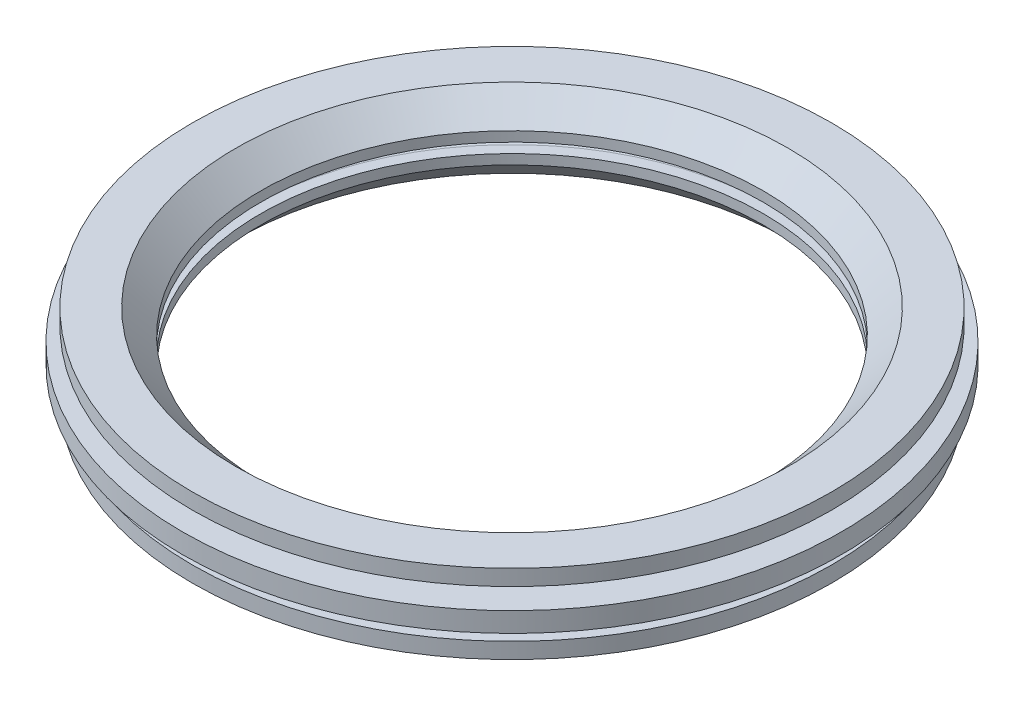
ISO-10303-21;
HEADER;
FILE_DESCRIPTION(('STEP AP214'),'2;1');
FILE_NAME('part.step','',(''),(''),'','','');
FILE_SCHEMA(('AUTOMOTIVE_DESIGN { 1 0 10303 214 1 1 1 1 }'));
ENDSEC;
DATA;
#1=APPLICATION_CONTEXT('core data for automotive mechanical design processes');
#2=APPLICATION_PROTOCOL_DEFINITION('international standard','automotive_design',2000,#1);
#3=PRODUCT_CONTEXT('',#1,'mechanical');
#4=PRODUCT('Part','Part','',(#3));
#5=PRODUCT_RELATED_PRODUCT_CATEGORY('part','',(#4));
#6=PRODUCT_DEFINITION_FORMATION('','',#4);
#7=PRODUCT_DEFINITION_CONTEXT('part definition',#1,'design');
#8=PRODUCT_DEFINITION('design','',#6,#7);
#9=PRODUCT_DEFINITION_SHAPE('','',#8);
#10=(LENGTH_UNIT() NAMED_UNIT(*) SI_UNIT(.MILLI.,.METRE.));
#11=(NAMED_UNIT(*) PLANE_ANGLE_UNIT() SI_UNIT($,.RADIAN.));
#12=(NAMED_UNIT(*) SI_UNIT($,.STERADIAN.) SOLID_ANGLE_UNIT());
#13=UNCERTAINTY_MEASURE_WITH_UNIT(LENGTH_MEASURE(1.E-05),#10,'distance_accuracy_value','');
#14=(GEOMETRIC_REPRESENTATION_CONTEXT(3) GLOBAL_UNCERTAINTY_ASSIGNED_CONTEXT((#13)) GLOBAL_UNIT_ASSIGNED_CONTEXT((#10,
#11,#12)) REPRESENTATION_CONTEXT('',''));
#15=CARTESIAN_POINT('',(0.,0.,0.));
#16=DIRECTION('',(0.,0.,1.));
#17=DIRECTION('',(1.,0.,0.));
#18=AXIS2_PLACEMENT_3D('',#15,#16,#17);
#19=CARTESIAN_POINT('',(40.386,0.793749999999989,0.));
#20=DIRECTION('',(0.,-1.,0.));
#21=DIRECTION('',(0.,0.,-1.));
#22=AXIS2_PLACEMENT_3D('',#19,#20,#21);
#23=PLANE('',#22);
#24=CARTESIAN_POINT('',(0.,0.793749999999977,0.));
#25=DIRECTION('',(0.,-1.,0.));
#26=DIRECTION('',(0.,0.,-1.));
#27=AXIS2_PLACEMENT_3D('',#24,#25,#26);
#28=CIRCLE('',#27,42.13225);
#29=CARTESIAN_POINT('',(0.,0.793749999999977,-42.13225));
#30=VERTEX_POINT('',#29);
#31=EDGE_CURVE('E10',#30,#30,#28,.T.);
#32=ORIENTED_EDGE('',*,*,#31,.T.);
#33=EDGE_LOOP('',(#32));
#34=FACE_BOUND('',#33,.T.);
#35=CARTESIAN_POINT('',(0.,0.79375,0.));
#36=DIRECTION('',(0.,-1.,0.));
#37=DIRECTION('',(0.,0.,-1.));
#38=AXIS2_PLACEMENT_3D('',#35,#36,#37);
#39=CIRCLE('',#38,40.386);
#40=CARTESIAN_POINT('',(0.,0.79375,-40.386));
#41=VERTEX_POINT('',#40);
#42=EDGE_CURVE('E61',#41,#41,#39,.T.);
#43=ORIENTED_EDGE('',*,*,#42,.F.);
#44=EDGE_LOOP('',(#43));
#45=FACE_BOUND('',#44,.T.);
#46=ADVANCED_FACE('F30',(#34,#45),#23,.T.);
#47=CARTESIAN_POINT('',(0.,0.,0.));
#48=DIRECTION('',(0.,-1.,0.));
#49=DIRECTION('',(0.,0.,-1.));
#50=AXIS2_PLACEMENT_3D('',#47,#48,#49);
#51=TOROIDAL_SURFACE('',#50,42.13225,0.793749999999977);
#52=ORIENTED_EDGE('',*,*,#31,.F.);
#53=EDGE_LOOP('',(#52));
#54=FACE_BOUND('',#53,.T.);
#55=CARTESIAN_POINT('',(0.,-0.793749999999977,0.));
#56=DIRECTION('',(0.,-1.,0.));
#57=DIRECTION('',(0.,0.,-1.));
#58=AXIS2_PLACEMENT_3D('',#55,#56,#57);
#59=CIRCLE('',#58,42.13225);
#60=CARTESIAN_POINT('',(0.,-0.793749999999977,-42.13225));
#61=VERTEX_POINT('',#60);
#62=EDGE_CURVE('E64',#61,#61,#59,.T.);
#63=ORIENTED_EDGE('',*,*,#62,.T.);
#64=EDGE_LOOP('',(#63));
#65=FACE_BOUND('',#64,.T.);
#66=ADVANCED_FACE('F139',(#54,#65),#51,.F.);
#67=CARTESIAN_POINT('',(0.,0.,0.));
#68=DIRECTION('',(0.,-1.,0.));
#69=DIRECTION('',(0.,0.,-1.));
#70=AXIS2_PLACEMENT_3D('',#67,#68,#69);
#71=CYLINDRICAL_SURFACE('',#70,52.959);
#72=CARTESIAN_POINT('',(0.,1.5875,0.));
#73=DIRECTION('',(0.,-1.,0.));
#74=DIRECTION('',(0.,0.,-1.));
#75=AXIS2_PLACEMENT_3D('',#72,#73,#74);
#76=CIRCLE('',#75,52.959);
#77=CARTESIAN_POINT('',(0.,1.5875,-52.959));
#78=VERTEX_POINT('',#77);
#79=EDGE_CURVE('E36',#78,#78,#76,.T.);
#80=ORIENTED_EDGE('',*,*,#79,.T.);
#81=EDGE_LOOP('',(#80));
#82=FACE_BOUND('',#81,.T.);
#83=CARTESIAN_POINT('',(0.,-1.5875,0.));
#84=DIRECTION('',(0.,-1.,0.));
#85=DIRECTION('',(0.,0.,-1.));
#86=AXIS2_PLACEMENT_3D('',#83,#84,#85);
#87=CIRCLE('',#86,52.959);
#88=CARTESIAN_POINT('',(0.,-1.5875,-52.959));
#89=VERTEX_POINT('',#88);
#90=EDGE_CURVE('E67',#89,#89,#87,.T.);
#91=ORIENTED_EDGE('',*,*,#90,.F.);
#92=EDGE_LOOP('',(#91));
#93=FACE_BOUND('',#92,.T.);
#94=ADVANCED_FACE('F136',(#82,#93),#71,.T.);
#95=CARTESIAN_POINT('',(46.2915,1.5875,0.));
#96=DIRECTION('',(0.,1.,0.));
#97=DIRECTION('',(0.,0.,1.));
#98=AXIS2_PLACEMENT_3D('',#95,#96,#97);
#99=PLANE('',#98);
#100=CARTESIAN_POINT('',(0.,1.5875,0.));
#101=DIRECTION('',(0.,-1.,0.));
#102=DIRECTION('',(0.,0.,-1.));
#103=AXIS2_PLACEMENT_3D('',#100,#101,#102);
#104=CIRCLE('',#103,46.2915);
#105=CARTESIAN_POINT('',(0.,1.5875,-46.2915));
#106=VERTEX_POINT('',#105);
#107=EDGE_CURVE('E40',#106,#106,#104,.T.);
#108=ORIENTED_EDGE('',*,*,#107,.T.);
#109=EDGE_LOOP('',(#108));
#110=FACE_BOUND('',#109,.T.);
#111=ORIENTED_EDGE('',*,*,#79,.F.);
#112=EDGE_LOOP('',(#111));
#113=FACE_BOUND('',#112,.T.);
#114=ADVANCED_FACE('F138',(#110,#113),#99,.T.);
#115=CARTESIAN_POINT('',(0.,0.,0.));
#116=DIRECTION('',(0.,-1.,0.));
#117=DIRECTION('',(0.,0.,-1.));
#118=AXIS2_PLACEMENT_3D('',#115,#116,#117);
#119=CYLINDRICAL_SURFACE('',#118,46.2915);
#120=CARTESIAN_POINT('',(0.,3.81,0.));
#121=DIRECTION('',(0.,-1.,0.));
#122=DIRECTION('',(0.,0.,-1.));
#123=AXIS2_PLACEMENT_3D('',#120,#121,#122);
#124=CIRCLE('',#123,46.2915);
#125=CARTESIAN_POINT('',(0.,3.81,-46.2915));
#126=VERTEX_POINT('',#125);
#127=EDGE_CURVE('E44',#126,#126,#124,.T.);
#128=ORIENTED_EDGE('',*,*,#127,.T.);
#129=EDGE_LOOP('',(#128));
#130=FACE_BOUND('',#129,.T.);
#131=ORIENTED_EDGE('',*,*,#107,.F.);
#132=EDGE_LOOP('',(#131));
#133=FACE_BOUND('',#132,.T.);
#134=ADVANCED_FACE('F145',(#130,#133),#119,.T.);
#135=CARTESIAN_POINT('',(51.3715,3.81,0.));
#136=DIRECTION('',(0.,-1.,0.));
#137=DIRECTION('',(0.,0.,-1.));
#138=AXIS2_PLACEMENT_3D('',#135,#136,#137);
#139=PLANE('',#138);
#140=CARTESIAN_POINT('',(0.,3.81,0.));
#141=DIRECTION('',(0.,-1.,0.));
#142=DIRECTION('',(0.,0.,-1.));
#143=AXIS2_PLACEMENT_3D('',#140,#141,#142);
#144=CIRCLE('',#143,51.3715);
#145=CARTESIAN_POINT('',(0.,3.81,-51.3715));
#146=VERTEX_POINT('',#145);
#147=EDGE_CURVE('E49',#146,#146,#144,.T.);
#148=ORIENTED_EDGE('',*,*,#147,.T.);
#149=EDGE_LOOP('',(#148));
#150=FACE_BOUND('',#149,.T.);
#151=ORIENTED_EDGE('',*,*,#127,.F.);
#152=EDGE_LOOP('',(#151));
#153=FACE_BOUND('',#152,.T.);
#154=ADVANCED_FACE('F176',(#150,#153),#139,.T.);
#155=CARTESIAN_POINT('',(0.,0.,0.));
#156=DIRECTION('',(0.,-1.,0.));
#157=DIRECTION('',(0.,0.,-1.));
#158=AXIS2_PLACEMENT_3D('',#155,#156,#157);
#159=CYLINDRICAL_SURFACE('',#158,51.3715);
#160=CARTESIAN_POINT('',(0.,6.35,0.));
#161=DIRECTION('',(0.,-1.,0.));
#162=DIRECTION('',(0.,0.,-1.));
#163=AXIS2_PLACEMENT_3D('',#160,#161,#162);
#164=CIRCLE('',#163,51.3715);
#165=CARTESIAN_POINT('',(0.,6.35,-51.3715));
#166=VERTEX_POINT('',#165);
#167=EDGE_CURVE('E52',#166,#166,#164,.T.);
#168=ORIENTED_EDGE('',*,*,#167,.T.);
#169=EDGE_LOOP('',(#168));
#170=FACE_BOUND('',#169,.T.);
#171=ORIENTED_EDGE('',*,*,#147,.F.);
#172=EDGE_LOOP('',(#171));
#173=FACE_BOUND('',#172,.T.);
#174=ADVANCED_FACE('F170',(#170,#173),#159,.T.);
#175=CARTESIAN_POINT('',(44.35475,6.35,0.));
#176=DIRECTION('',(0.,1.,0.));
#177=DIRECTION('',(0.,0.,1.));
#178=AXIS2_PLACEMENT_3D('',#175,#176,#177);
#179=PLANE('',#178);
#180=CARTESIAN_POINT('',(0.,6.35,0.));
#181=DIRECTION('',(0.,-1.,0.));
#182=DIRECTION('',(0.,0.,-1.));
#183=AXIS2_PLACEMENT_3D('',#180,#181,#182);
#184=CIRCLE('',#183,44.35475);
#185=CARTESIAN_POINT('',(0.,6.35,-44.35475));
#186=VERTEX_POINT('',#185);
#187=EDGE_CURVE('E55',#186,#186,#184,.T.);
#188=ORIENTED_EDGE('',*,*,#187,.T.);
#189=EDGE_LOOP('',(#188));
#190=FACE_BOUND('',#189,.T.);
#191=ORIENTED_EDGE('',*,*,#167,.F.);
#192=EDGE_LOOP('',(#191));
#193=FACE_BOUND('',#192,.T.);
#194=ADVANCED_FACE('F164',(#190,#193),#179,.T.);
#195=CARTESIAN_POINT('',(0.,6.35,0.));
#196=DIRECTION('',(0.,1.,0.));
#197=DIRECTION('',(0.,0.,1.));
#198=AXIS2_PLACEMENT_3D('',#195,#196,#197);
#199=CONICAL_SURFACE('',#198,44.35475,0.78539816339745);
#200=CARTESIAN_POINT('',(0.,2.38125,0.));
#201=DIRECTION('',(0.,-1.,0.));
#202=DIRECTION('',(0.,0.,-1.));
#203=AXIS2_PLACEMENT_3D('',#200,#201,#202);
#204=CIRCLE('',#203,40.386);
#205=CARTESIAN_POINT('',(0.,2.38125,-40.386));
#206=VERTEX_POINT('',#205);
#207=EDGE_CURVE('E58',#206,#206,#204,.T.);
#208=ORIENTED_EDGE('',*,*,#207,.T.);
#209=EDGE_LOOP('',(#208));
#210=FACE_BOUND('',#209,.T.);
#211=ORIENTED_EDGE('',*,*,#187,.F.);
#212=EDGE_LOOP('',(#211));
#213=FACE_BOUND('',#212,.T.);
#214=ADVANCED_FACE('F158',(#210,#213),#199,.F.);
#215=CARTESIAN_POINT('',(0.,0.,0.));
#216=DIRECTION('',(0.,-1.,0.));
#217=DIRECTION('',(0.,0.,-1.));
#218=AXIS2_PLACEMENT_3D('',#215,#216,#217);
#219=CYLINDRICAL_SURFACE('',#218,40.386);
#220=ORIENTED_EDGE('',*,*,#42,.T.);
#221=EDGE_LOOP('',(#220));
#222=FACE_BOUND('',#221,.T.);
#223=ORIENTED_EDGE('',*,*,#207,.F.);
#224=EDGE_LOOP('',(#223));
#225=FACE_BOUND('',#224,.T.);
#226=ADVANCED_FACE('F155',(#222,#225),#219,.F.);
#227=CARTESIAN_POINT('',(40.386,-0.793749999999989,0.));
#228=DIRECTION('',(0.,1.,0.));
#229=DIRECTION('',(0.,0.,-1.));
#230=AXIS2_PLACEMENT_3D('',#227,#228,#229);
#231=PLANE('',#230);
#232=ORIENTED_EDGE('',*,*,#62,.F.);
#233=EDGE_LOOP('',(#232));
#234=FACE_BOUND('',#233,.T.);
#235=CARTESIAN_POINT('',(0.,-0.79375,0.));
#236=DIRECTION('',(0.,-1.,0.));
#237=DIRECTION('',(0.,0.,-1.));
#238=AXIS2_PLACEMENT_3D('',#235,#236,#237);
#239=CIRCLE('',#238,40.386);
#240=CARTESIAN_POINT('',(0.,-0.79375,-40.386));
#241=VERTEX_POINT('',#240);
#242=EDGE_CURVE('E88',#241,#241,#239,.T.);
#243=ORIENTED_EDGE('',*,*,#242,.T.);
#244=EDGE_LOOP('',(#243));
#245=FACE_BOUND('',#244,.T.);
#246=ADVANCED_FACE('F92',(#234,#245),#231,.T.);
#247=CARTESIAN_POINT('',(46.2915,-1.5875,0.));
#248=DIRECTION('',(0.,-1.,0.));
#249=DIRECTION('',(0.,0.,1.));
#250=AXIS2_PLACEMENT_3D('',#247,#248,#249);
#251=PLANE('',#250);
#252=CARTESIAN_POINT('',(0.,-1.5875,0.));
#253=DIRECTION('',(0.,-1.,0.));
#254=DIRECTION('',(0.,0.,-1.));
#255=AXIS2_PLACEMENT_3D('',#252,#253,#254);
#256=CIRCLE('',#255,46.2915);
#257=CARTESIAN_POINT('',(0.,-1.5875,-46.2915));
#258=VERTEX_POINT('',#257);
#259=EDGE_CURVE('E70',#258,#258,#256,.T.);
#260=ORIENTED_EDGE('',*,*,#259,.F.);
#261=EDGE_LOOP('',(#260));
#262=FACE_BOUND('',#261,.T.);
#263=ORIENTED_EDGE('',*,*,#90,.T.);
#264=EDGE_LOOP('',(#263));
#265=FACE_BOUND('',#264,.T.);
#266=ADVANCED_FACE('F127',(#262,#265),#251,.T.);
#267=CARTESIAN_POINT('',(0.,0.,0.));
#268=DIRECTION('',(0.,1.,0.));
#269=DIRECTION('',(0.,0.,-1.));
#270=AXIS2_PLACEMENT_3D('',#267,#268,#269);
#271=CYLINDRICAL_SURFACE('',#270,46.2915);
#272=CARTESIAN_POINT('',(0.,-3.81,0.));
#273=DIRECTION('',(0.,-1.,0.));
#274=DIRECTION('',(0.,0.,-1.));
#275=AXIS2_PLACEMENT_3D('',#272,#273,#274);
#276=CIRCLE('',#275,46.2915);
#277=CARTESIAN_POINT('',(0.,-3.81,-46.2915));
#278=VERTEX_POINT('',#277);
#279=EDGE_CURVE('E73',#278,#278,#276,.T.);
#280=ORIENTED_EDGE('',*,*,#279,.F.);
#281=EDGE_LOOP('',(#280));
#282=FACE_BOUND('',#281,.T.);
#283=ORIENTED_EDGE('',*,*,#259,.T.);
#284=EDGE_LOOP('',(#283));
#285=FACE_BOUND('',#284,.T.);
#286=ADVANCED_FACE('F121',(#282,#285),#271,.T.);
#287=CARTESIAN_POINT('',(51.3715,-3.81,0.));
#288=DIRECTION('',(0.,1.,0.));
#289=DIRECTION('',(0.,0.,-1.));
#290=AXIS2_PLACEMENT_3D('',#287,#288,#289);
#291=PLANE('',#290);
#292=CARTESIAN_POINT('',(0.,-3.81,0.));
#293=DIRECTION('',(0.,-1.,0.));
#294=DIRECTION('',(0.,0.,-1.));
#295=AXIS2_PLACEMENT_3D('',#292,#293,#294);
#296=CIRCLE('',#295,51.3715);
#297=CARTESIAN_POINT('',(0.,-3.81,-51.3715));
#298=VERTEX_POINT('',#297);
#299=EDGE_CURVE('E76',#298,#298,#296,.T.);
#300=ORIENTED_EDGE('',*,*,#299,.F.);
#301=EDGE_LOOP('',(#300));
#302=FACE_BOUND('',#301,.T.);
#303=ORIENTED_EDGE('',*,*,#279,.T.);
#304=EDGE_LOOP('',(#303));
#305=FACE_BOUND('',#304,.T.);
#306=ADVANCED_FACE('F115',(#302,#305),#291,.T.);
#307=CARTESIAN_POINT('',(0.,0.,0.));
#308=DIRECTION('',(0.,1.,0.));
#309=DIRECTION('',(0.,0.,-1.));
#310=AXIS2_PLACEMENT_3D('',#307,#308,#309);
#311=CYLINDRICAL_SURFACE('',#310,51.3715);
#312=CARTESIAN_POINT('',(0.,-6.35,0.));
#313=DIRECTION('',(0.,-1.,0.));
#314=DIRECTION('',(0.,0.,-1.));
#315=AXIS2_PLACEMENT_3D('',#312,#313,#314);
#316=CIRCLE('',#315,51.3715);
#317=CARTESIAN_POINT('',(0.,-6.35,-51.3715));
#318=VERTEX_POINT('',#317);
#319=EDGE_CURVE('E79',#318,#318,#316,.T.);
#320=ORIENTED_EDGE('',*,*,#319,.F.);
#321=EDGE_LOOP('',(#320));
#322=FACE_BOUND('',#321,.T.);
#323=ORIENTED_EDGE('',*,*,#299,.T.);
#324=EDGE_LOOP('',(#323));
#325=FACE_BOUND('',#324,.T.);
#326=ADVANCED_FACE('F109',(#322,#325),#311,.T.);
#327=CARTESIAN_POINT('',(44.35475,-6.35,0.));
#328=DIRECTION('',(0.,-1.,0.));
#329=DIRECTION('',(0.,0.,1.));
#330=AXIS2_PLACEMENT_3D('',#327,#328,#329);
#331=PLANE('',#330);
#332=CARTESIAN_POINT('',(0.,-6.35,0.));
#333=DIRECTION('',(0.,-1.,0.));
#334=DIRECTION('',(0.,0.,-1.));
#335=AXIS2_PLACEMENT_3D('',#332,#333,#334);
#336=CIRCLE('',#335,44.35475);
#337=CARTESIAN_POINT('',(0.,-6.35,-44.35475));
#338=VERTEX_POINT('',#337);
#339=EDGE_CURVE('E82',#338,#338,#336,.T.);
#340=ORIENTED_EDGE('',*,*,#339,.F.);
#341=EDGE_LOOP('',(#340));
#342=FACE_BOUND('',#341,.T.);
#343=ORIENTED_EDGE('',*,*,#319,.T.);
#344=EDGE_LOOP('',(#343));
#345=FACE_BOUND('',#344,.T.);
#346=ADVANCED_FACE('F103',(#342,#345),#331,.T.);
#347=CARTESIAN_POINT('',(0.,-6.35,0.));
#348=DIRECTION('',(0.,-1.,0.));
#349=DIRECTION('',(0.,0.,1.));
#350=AXIS2_PLACEMENT_3D('',#347,#348,#349);
#351=CONICAL_SURFACE('',#350,44.35475,0.78539816339745);
#352=CARTESIAN_POINT('',(0.,-2.38125,0.));
#353=DIRECTION('',(0.,-1.,0.));
#354=DIRECTION('',(0.,0.,-1.));
#355=AXIS2_PLACEMENT_3D('',#352,#353,#354);
#356=CIRCLE('',#355,40.386);
#357=CARTESIAN_POINT('',(0.,-2.38125,-40.386));
#358=VERTEX_POINT('',#357);
#359=EDGE_CURVE('E85',#358,#358,#356,.T.);
#360=ORIENTED_EDGE('',*,*,#359,.F.);
#361=EDGE_LOOP('',(#360));
#362=FACE_BOUND('',#361,.T.);
#363=ORIENTED_EDGE('',*,*,#339,.T.);
#364=EDGE_LOOP('',(#363));
#365=FACE_BOUND('',#364,.T.);
#366=ADVANCED_FACE('F97',(#362,#365),#351,.F.);
#367=CARTESIAN_POINT('',(0.,0.,0.));
#368=DIRECTION('',(0.,1.,0.));
#369=DIRECTION('',(0.,0.,-1.));
#370=AXIS2_PLACEMENT_3D('',#367,#368,#369);
#371=CYLINDRICAL_SURFACE('',#370,40.386);
#372=ORIENTED_EDGE('',*,*,#242,.F.);
#373=EDGE_LOOP('',(#372));
#374=FACE_BOUND('',#373,.T.);
#375=ORIENTED_EDGE('',*,*,#359,.T.);
#376=EDGE_LOOP('',(#375));
#377=FACE_BOUND('',#376,.T.);
#378=ADVANCED_FACE('F94',(#374,#377),#371,.F.);
#379=CLOSED_SHELL('',(#46,#66,#94,#114,#134,#154,#174,#194,#214,#226,#246,#266,#286,#306,#326,
#346,#366,#378));
#380=MANIFOLD_SOLID_BREP('B2',#379);
#381=ADVANCED_BREP_SHAPE_REPRESENTATION('',(#18,#380),#14);
#382=SHAPE_DEFINITION_REPRESENTATION(#9,#381);
ENDSEC;
END-ISO-10303-21;
